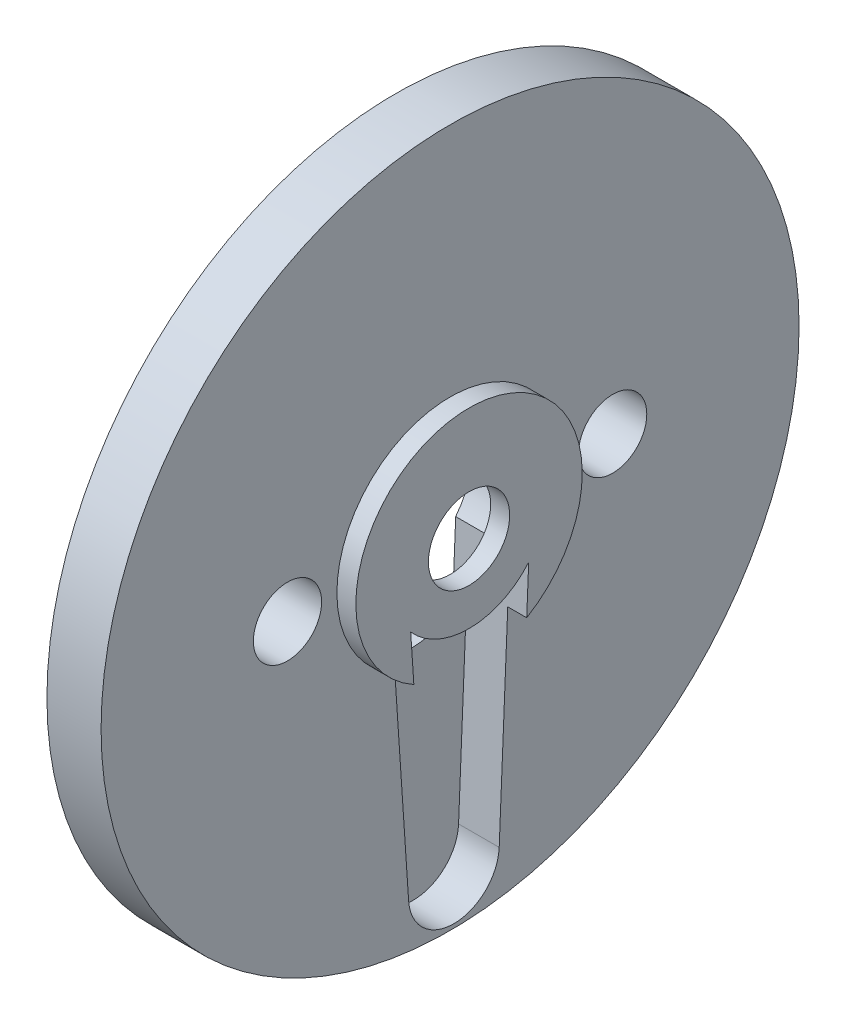
ISO-10303-21;
HEADER;
FILE_DESCRIPTION(('STEP AP214'),'2;1');
FILE_NAME('part.step','',(''),(''),'','','');
FILE_SCHEMA(('AUTOMOTIVE_DESIGN { 1 0 10303 214 1 1 1 1 }'));
ENDSEC;
DATA;
#1=APPLICATION_CONTEXT('core data for automotive mechanical design processes');
#2=APPLICATION_PROTOCOL_DEFINITION('international standard','automotive_design',2000,#1);
#3=PRODUCT_CONTEXT('',#1,'mechanical');
#4=PRODUCT('Part','Part','',(#3));
#5=PRODUCT_RELATED_PRODUCT_CATEGORY('part','',(#4));
#6=PRODUCT_DEFINITION_FORMATION('','',#4);
#7=PRODUCT_DEFINITION_CONTEXT('part definition',#1,'design');
#8=PRODUCT_DEFINITION('design','',#6,#7);
#9=PRODUCT_DEFINITION_SHAPE('','',#8);
#10=(LENGTH_UNIT() NAMED_UNIT(*) SI_UNIT(.MILLI.,.METRE.));
#11=(NAMED_UNIT(*) PLANE_ANGLE_UNIT() SI_UNIT($,.RADIAN.));
#12=(NAMED_UNIT(*) SI_UNIT($,.STERADIAN.) SOLID_ANGLE_UNIT());
#13=UNCERTAINTY_MEASURE_WITH_UNIT(LENGTH_MEASURE(1.E-05),#10,'distance_accuracy_value','');
#14=(GEOMETRIC_REPRESENTATION_CONTEXT(3) GLOBAL_UNCERTAINTY_ASSIGNED_CONTEXT((#13)) GLOBAL_UNIT_ASSIGNED_CONTEXT((#10,
#11,#12)) REPRESENTATION_CONTEXT('',''));
#15=CARTESIAN_POINT('',(0.,0.,0.));
#16=DIRECTION('',(0.,0.,1.));
#17=DIRECTION('',(1.,0.,0.));
#18=AXIS2_PLACEMENT_3D('',#15,#16,#17);
#19=CARTESIAN_POINT('',(-24.638,0.,0.));
#20=DIRECTION('',(-1.,0.,0.));
#21=DIRECTION('',(0.,0.,1.));
#22=AXIS2_PLACEMENT_3D('',#19,#20,#21);
#23=CYLINDRICAL_SURFACE('',#22,3.6576);
#24=CARTESIAN_POINT('',(-25.273,0.,0.));
#25=DIRECTION('',(1.,0.,0.));
#26=DIRECTION('',(0.,0.,-1.));
#27=AXIS2_PLACEMENT_3D('',#24,#25,#26);
#28=CIRCLE('',#27,3.6576);
#29=CARTESIAN_POINT('',(-25.273,-2.42670735163177,2.73662733844715));
#30=VERTEX_POINT('',#29);
#31=CARTESIAN_POINT('',(-25.273,-2.35646642029157,-2.79733869419458));
#32=VERTEX_POINT('',#31);
#33=EDGE_CURVE('E122',#30,#32,#28,.T.);
#34=ORIENTED_EDGE('',*,*,#33,.F.);
#35=DIRECTION('',(-1.,0.,0.));
#36=VECTOR('',#35,1.);
#37=CARTESIAN_POINT('',(-25.908,-2.42670735163177,2.73662733844715));
#38=LINE('',#37,#36);
#39=CARTESIAN_POINT('',(-26.162,-2.42670735163177,2.73662733844715));
#40=VERTEX_POINT('',#39);
#41=EDGE_CURVE('E12',#30,#40,#38,.T.);
#42=ORIENTED_EDGE('',*,*,#41,.T.);
#43=CARTESIAN_POINT('',(-26.162,0.,0.));
#44=DIRECTION('',(1.,0.,0.));
#45=DIRECTION('',(0.,0.,-1.));
#46=AXIS2_PLACEMENT_3D('',#43,#44,#45);
#47=CIRCLE('',#46,3.6576);
#48=CARTESIAN_POINT('',(-26.162,-2.35646642029157,-2.79733869419458));
#49=VERTEX_POINT('',#48);
#50=EDGE_CURVE('E136',#40,#49,#47,.T.);
#51=ORIENTED_EDGE('',*,*,#50,.T.);
#52=DIRECTION('',(-1.,0.,0.));
#53=VECTOR('',#52,1.);
#54=CARTESIAN_POINT('',(-26.162,-2.35646642029157,-2.79733869419458));
#55=LINE('',#54,#53);
#56=EDGE_CURVE('E57',#49,#32,#55,.F.);
#57=ORIENTED_EDGE('',*,*,#56,.T.);
#58=EDGE_LOOP('',(#34,#42,#51,#57));
#59=FACE_BOUND('',#58,.T.);
#60=ADVANCED_FACE('F49',(#59),#23,.T.);
#61=CARTESIAN_POINT('',(-25.273,-2.29265809919101,2.74565981873462));
#62=DIRECTION('',(0.,0.0672293546334898,-0.997737547592334));
#63=DIRECTION('',(0.,0.997737547592334,0.0672293546334898));
#64=AXIS2_PLACEMENT_3D('',#61,#62,#63);
#65=PLANE('',#64);
#66=ORIENTED_EDGE('',*,*,#41,.F.);
#67=DIRECTION('',(0.,0.997737547592334,0.0672293546334893));
#68=VECTOR('',#67,1.);
#69=CARTESIAN_POINT('',(-25.273,-4.63512913951605,2.58781989713528));
#70=LINE('',#69,#68);
#71=CARTESIAN_POINT('',(-25.273,-4.63512913951605,2.58781989713528));
#72=VERTEX_POINT('',#71);
#73=EDGE_CURVE('E125',#72,#30,#70,.T.);
#74=ORIENTED_EDGE('',*,*,#73,.F.);
#75=DIRECTION('',(1.,0.,0.));
#76=VECTOR('',#75,1.);
#77=CARTESIAN_POINT('',(-40.7085695282448,-4.63512913951605,2.58781989713528));
#78=LINE('',#77,#76);
#79=CARTESIAN_POINT('',(-26.162,-4.63512913951605,2.58781989713528));
#80=VERTEX_POINT('',#79);
#81=EDGE_CURVE('E209',#80,#72,#78,.T.);
#82=ORIENTED_EDGE('',*,*,#81,.F.);
#83=DIRECTION('',(0.,-0.997737547592334,-0.0672293546334898));
#84=VECTOR('',#83,1.);
#85=CARTESIAN_POINT('',(-26.162,-0.194533638235004,2.88703522731896));
#86=LINE('',#85,#84);
#87=CARTESIAN_POINT('',(-26.162,-14.1918652152658,1.94386979189401));
#88=VERTEX_POINT('',#87);
#89=EDGE_CURVE('E163',#80,#88,#86,.T.);
#90=ORIENTED_EDGE('',*,*,#89,.T.);
#91=DIRECTION('',(-1.,0.,0.));
#92=VECTOR('',#91,1.);
#93=CARTESIAN_POINT('',(-25.273,-14.1918652152658,1.94386979189401));
#94=LINE('',#93,#92);
#95=CARTESIAN_POINT('',(-28.067,-14.1918652152658,1.94386979189401));
#96=VERTEX_POINT('',#95);
#97=EDGE_CURVE('E178',#88,#96,#94,.T.);
#98=ORIENTED_EDGE('',*,*,#97,.T.);
#99=DIRECTION('',(0.,-0.997737547592334,-0.0672293546334898));
#100=VECTOR('',#99,1.);
#101=CARTESIAN_POINT('',(-28.067,-2.29265809919101,2.74565981873462));
#102=LINE('',#101,#100);
#103=CARTESIAN_POINT('',(-28.067,-5.00603592916988,2.5628275289942));
#104=VERTEX_POINT('',#103);
#105=EDGE_CURVE('E154',#104,#96,#102,.T.);
#106=ORIENTED_EDGE('',*,*,#105,.F.);
#107=DIRECTION('',(1.,0.,0.));
#108=VECTOR('',#107,1.);
#109=CARTESIAN_POINT('',(-30.353,-5.00603592916988,2.5628275289942));
#110=LINE('',#109,#108);
#111=CARTESIAN_POINT('',(-28.702,-5.00603592916988,2.5628275289942));
#112=VERTEX_POINT('',#111);
#113=EDGE_CURVE('E198',#112,#104,#110,.T.);
#114=ORIENTED_EDGE('',*,*,#113,.F.);
#115=DIRECTION('',(0.,0.997737547592334,0.0672293546334898));
#116=VECTOR('',#115,1.);
#117=CARTESIAN_POINT('',(-28.702,-0.194533638235004,2.88703522731896));
#118=LINE('',#117,#116);
#119=CARTESIAN_POINT('',(-28.702,-2.29265809919101,2.74565981873462));
#120=VERTEX_POINT('',#119);
#121=EDGE_CURVE('E147',#112,#120,#118,.T.);
#122=ORIENTED_EDGE('',*,*,#121,.T.);
#123=DIRECTION('',(-1.,0.,0.));
#124=VECTOR('',#123,1.);
#125=CARTESIAN_POINT('',(-25.273,-2.29265809919101,2.74565981873462));
#126=LINE('',#125,#124);
#127=CARTESIAN_POINT('',(-26.162,-2.29265809919101,2.74565981873462));
#128=VERTEX_POINT('',#127);
#129=EDGE_CURVE('E174',#128,#120,#126,.T.);
#130=ORIENTED_EDGE('',*,*,#129,.F.);
#131=EDGE_CURVE('E160',#128,#40,#86,.T.);
#132=ORIENTED_EDGE('',*,*,#131,.T.);
#133=EDGE_LOOP('',(#66,#74,#82,#90,#98,#106,#114,#122,#130,#132));
#134=FACE_BOUND('',#133,.T.);
#135=ADVANCED_FACE('F221',(#134),#65,.T.);
#136=CARTESIAN_POINT('',(-25.273,-14.1379552704451,-2.30345150307179));
#137=DIRECTION('',(0.,0.0418838234530849,0.999122487652516));
#138=DIRECTION('',(0.,-0.999122487652516,0.0418838234530849));
#139=AXIS2_PLACEMENT_3D('',#136,#137,#138);
#140=PLANE('',#139);
#141=DIRECTION('',(1.,0.,0.));
#142=VECTOR('',#141,1.);
#143=CARTESIAN_POINT('',(-40.7085695282448,-4.5679536754535,-2.70463180098714));
#144=LINE('',#143,#142);
#145=CARTESIAN_POINT('',(-26.162,-4.5679536754535,-2.70463180098715));
#146=VERTEX_POINT('',#145);
#147=CARTESIAN_POINT('',(-25.273,-4.5679536754535,-2.70463180098714));
#148=VERTEX_POINT('',#147);
#149=EDGE_CURVE('E132',#146,#148,#144,.T.);
#150=ORIENTED_EDGE('',*,*,#149,.T.);
#151=DIRECTION('',(0.,-0.999122487652515,0.0418838234530849));
#152=VECTOR('',#151,1.);
#153=CARTESIAN_POINT('',(-25.273,-2.35646642029157,-2.79733869419458));
#154=LINE('',#153,#152);
#155=EDGE_CURVE('E64',#32,#148,#154,.T.);
#156=ORIENTED_EDGE('',*,*,#155,.F.);
#157=ORIENTED_EDGE('',*,*,#56,.F.);
#158=DIRECTION('',(0.,0.999122487652516,-0.0418838234530849));
#159=VECTOR('',#158,1.);
#160=CARTESIAN_POINT('',(-26.162,-0.121194270031896,-2.89104266469678));
#161=LINE('',#160,#159);
#162=CARTESIAN_POINT('',(-26.162,-2.22223109669393,-2.8029659207501));
#163=VERTEX_POINT('',#162);
#164=EDGE_CURVE('E169',#49,#163,#161,.T.);
#165=ORIENTED_EDGE('',*,*,#164,.T.);
#166=DIRECTION('',(-1.,0.,0.));
#167=VECTOR('',#166,1.);
#168=CARTESIAN_POINT('',(-25.273,-2.22223109669393,-2.8029659207501));
#169=LINE('',#168,#167);
#170=CARTESIAN_POINT('',(-28.702,-2.22223109669393,-2.8029659207501));
#171=VERTEX_POINT('',#170);
#172=EDGE_CURVE('E183',#163,#171,#169,.T.);
#173=ORIENTED_EDGE('',*,*,#172,.T.);
#174=DIRECTION('',(0.,-0.999122487652516,0.0418838234530849));
#175=VECTOR('',#174,1.);
#176=CARTESIAN_POINT('',(-28.702,-0.121194270031896,-2.89104266469678));
#177=LINE('',#176,#175);
#178=CARTESIAN_POINT('',(-28.702,-4.9009813445306,-2.69067107818389));
#179=VERTEX_POINT('',#178);
#180=EDGE_CURVE('E140',#171,#179,#177,.T.);
#181=ORIENTED_EDGE('',*,*,#180,.T.);
#182=DIRECTION('',(1.,0.,0.));
#183=VECTOR('',#182,1.);
#184=CARTESIAN_POINT('',(-30.353,-4.9009813445306,-2.69067107818389));
#185=LINE('',#184,#183);
#186=CARTESIAN_POINT('',(-28.067,-4.9009813445306,-2.69067107818389));
#187=VERTEX_POINT('',#186);
#188=EDGE_CURVE('E195',#179,#187,#185,.T.);
#189=ORIENTED_EDGE('',*,*,#188,.T.);
#190=DIRECTION('',(0.,0.999122487652516,-0.0418838234530849));
#191=VECTOR('',#190,1.);
#192=CARTESIAN_POINT('',(-28.067,-14.1379552704451,-2.30345150307179));
#193=LINE('',#192,#191);
#194=CARTESIAN_POINT('',(-28.067,-14.1379552704451,-2.30345150307179));
#195=VERTEX_POINT('',#194);
#196=EDGE_CURVE('E185',#195,#187,#193,.T.);
#197=ORIENTED_EDGE('',*,*,#196,.F.);
#198=DIRECTION('',(-1.,0.,0.));
#199=VECTOR('',#198,1.);
#200=CARTESIAN_POINT('',(-25.273,-14.1379552704451,-2.30345150307179));
#201=LINE('',#200,#199);
#202=CARTESIAN_POINT('',(-26.162,-14.1379552704451,-2.30345150307179));
#203=VERTEX_POINT('',#202);
#204=EDGE_CURVE('E181',#203,#195,#201,.T.);
#205=ORIENTED_EDGE('',*,*,#204,.F.);
#206=EDGE_CURVE('E167',#203,#146,#161,.T.);
#207=ORIENTED_EDGE('',*,*,#206,.T.);
#208=EDGE_LOOP('',(#150,#156,#157,#165,#173,#181,#189,#197,#205,#207));
#209=FACE_BOUND('',#208,.T.);
#210=ADVANCED_FACE('F130',(#209),#140,.T.);
#211=CARTESIAN_POINT('',(-24.638,0.,0.));
#212=DIRECTION('',(-1.,0.,0.));
#213=DIRECTION('',(0.,0.,1.));
#214=AXIS2_PLACEMENT_3D('',#211,#212,#213);
#215=CYLINDRICAL_SURFACE('',#214,1.905);
#216=CARTESIAN_POINT('',(-26.162,0.,0.));
#217=DIRECTION('',(1.,0.,0.));
#218=DIRECTION('',(0.,0.,-1.));
#219=AXIS2_PLACEMENT_3D('',#216,#217,#218);
#220=CIRCLE('',#219,1.905);
#221=CARTESIAN_POINT('',(-26.162,0.,1.905));
#222=VERTEX_POINT('',#221);
#223=EDGE_CURVE('E205',#222,#222,#220,.T.);
#224=CARTESIAN_POINT('',(-25.273,0.,0.));
#225=DIRECTION('',(1.,0.,0.));
#226=DIRECTION('',(0.,0.,-1.));
#227=AXIS2_PLACEMENT_3D('',#224,#225,#226);
#228=CIRCLE('',#227,1.905);
#229=CARTESIAN_POINT('',(-25.273,0.,1.905));
#230=VERTEX_POINT('',#229);
#231=EDGE_CURVE('E215',#230,#230,#228,.T.);
#232=CARTESIAN_POINT('',(-26.162,0.,1.905));
#233=CARTESIAN_POINT('',(-26.1527395833333,0.,1.905));
#234=CARTESIAN_POINT('',(-26.1434791666667,0.,1.905));
#235=CARTESIAN_POINT('',(-26.1249583333333,0.,1.905));
#236=CARTESIAN_POINT('',(-26.1156979166667,0.,1.905));
#237=CARTESIAN_POINT('',(-26.0971770833333,0.,1.905));
#238=CARTESIAN_POINT('',(-26.0879166666667,0.,1.905));
#239=CARTESIAN_POINT('',(-26.0693958333333,0.,1.905));
#240=CARTESIAN_POINT('',(-26.0601354166667,0.,1.905));
#241=CARTESIAN_POINT('',(-26.0416145833333,0.,1.905));
#242=CARTESIAN_POINT('',(-26.0323541666667,0.,1.905));
#243=CARTESIAN_POINT('',(-26.0138333333333,0.,1.905));
#244=CARTESIAN_POINT('',(-26.0045729166667,0.,1.905));
#245=CARTESIAN_POINT('',(-25.9860520833333,0.,1.905));
#246=CARTESIAN_POINT('',(-25.9767916666667,0.,1.905));
#247=CARTESIAN_POINT('',(-25.9582708333333,0.,1.905));
#248=CARTESIAN_POINT('',(-25.9490104166667,0.,1.905));
#249=CARTESIAN_POINT('',(-25.9304895833333,0.,1.905));
#250=CARTESIAN_POINT('',(-25.9212291666667,0.,1.905));
#251=CARTESIAN_POINT('',(-25.9027083333333,0.,1.905));
#252=CARTESIAN_POINT('',(-25.8934479166667,0.,1.905));
#253=CARTESIAN_POINT('',(-25.8749270833333,0.,1.905));
#254=CARTESIAN_POINT('',(-25.8656666666667,0.,1.905));
#255=CARTESIAN_POINT('',(-25.8471458333333,0.,1.905));
#256=CARTESIAN_POINT('',(-25.8378854166667,0.,1.905));
#257=CARTESIAN_POINT('',(-25.8193645833333,0.,1.905));
#258=CARTESIAN_POINT('',(-25.8101041666667,0.,1.905));
#259=CARTESIAN_POINT('',(-25.7915833333333,0.,1.905));
#260=CARTESIAN_POINT('',(-25.7823229166667,0.,1.905));
#261=CARTESIAN_POINT('',(-25.7638020833333,0.,1.905));
#262=CARTESIAN_POINT('',(-25.7545416666667,0.,1.905));
#263=CARTESIAN_POINT('',(-25.7360208333333,0.,1.905));
#264=CARTESIAN_POINT('',(-25.7267604166667,0.,1.905));
#265=CARTESIAN_POINT('',(-25.7082395833333,0.,1.905));
#266=CARTESIAN_POINT('',(-25.6989791666667,0.,1.905));
#267=CARTESIAN_POINT('',(-25.6804583333333,0.,1.905));
#268=CARTESIAN_POINT('',(-25.6711979166667,0.,1.905));
#269=CARTESIAN_POINT('',(-25.6526770833333,0.,1.905));
#270=CARTESIAN_POINT('',(-25.6434166666667,0.,1.905));
#271=CARTESIAN_POINT('',(-25.6248958333333,0.,1.905));
#272=CARTESIAN_POINT('',(-25.6156354166667,0.,1.905));
#273=CARTESIAN_POINT('',(-25.5971145833333,0.,1.905));
#274=CARTESIAN_POINT('',(-25.5878541666667,0.,1.905));
#275=CARTESIAN_POINT('',(-25.5693333333333,0.,1.905));
#276=CARTESIAN_POINT('',(-25.5600729166667,0.,1.905));
#277=CARTESIAN_POINT('',(-25.5415520833333,0.,1.905));
#278=CARTESIAN_POINT('',(-25.5322916666667,0.,1.905));
#279=CARTESIAN_POINT('',(-25.5137708333333,0.,1.905));
#280=CARTESIAN_POINT('',(-25.5045104166667,0.,1.905));
#281=CARTESIAN_POINT('',(-25.4859895833333,0.,1.905));
#282=CARTESIAN_POINT('',(-25.4767291666667,0.,1.905));
#283=CARTESIAN_POINT('',(-25.4582083333333,0.,1.905));
#284=CARTESIAN_POINT('',(-25.4489479166667,0.,1.905));
#285=CARTESIAN_POINT('',(-25.4304270833333,0.,1.905));
#286=CARTESIAN_POINT('',(-25.4211666666667,0.,1.905));
#287=CARTESIAN_POINT('',(-25.4026458333333,0.,1.905));
#288=CARTESIAN_POINT('',(-25.3933854166667,0.,1.905));
#289=CARTESIAN_POINT('',(-25.3748645833333,0.,1.905));
#290=CARTESIAN_POINT('',(-25.3656041666667,0.,1.905));
#291=CARTESIAN_POINT('',(-25.3470833333333,0.,1.905));
#292=CARTESIAN_POINT('',(-25.3378229166667,0.,1.905));
#293=CARTESIAN_POINT('',(-25.3193020833333,0.,1.905));
#294=CARTESIAN_POINT('',(-25.3100416666667,0.,1.905));
#295=CARTESIAN_POINT('',(-25.2915208333333,0.,1.905));
#296=CARTESIAN_POINT('',(-25.2822604166667,0.,1.905));
#297=CARTESIAN_POINT('',(-25.273,0.,1.905));
#298=B_SPLINE_CURVE_WITH_KNOTS('',3,(#232,#233,#234,#235,#236,#237,#238,#239,#240,#241,#242,
#243,#244,#245,#246,#247,#248,#249,#250,#251,#252,#253,#254,#255,#256,#257,#258,#259,#260,#261,
#262,#263,#264,#265,#266,#267,#268,#269,#270,#271,#272,#273,#274,#275,#276,#277,#278,#279,#280,
#281,#282,#283,#284,#285,#286,#287,#288,#289,#290,#291,#292,#293,#294,#295,#296,#297),
.UNSPECIFIED.,.F.,.F.,(4,2,2,2,2,2,2,2,2,2,2,2,2,2,2,2,2,2,2,2,2,2,2,2,2,2,2,2,2,2,2,2,4),(0.,
0.0277812500000009,0.0555625000000018,0.0833437500000027,0.111125,0.138906250000001,
0.166687500000002,0.194468750000003,0.22225,0.250031250000001,0.277812500000002,
0.305593750000003,0.333375,0.361156250000001,0.388937500000002,0.416718750000003,0.4445,
0.472281250000001,0.500062500000002,0.527843750000003,0.555625000000001,0.583406250000001,
0.611187500000002,0.638968750000003,0.666750000000001,0.694531250000002,0.722312500000002,
0.750093750000003,0.777875000000001,0.805656250000002,0.833437500000003,0.861218750000003,
0.889000000000001),.UNSPECIFIED.);
#299=EDGE_CURVE('BSEAM262',#222,#230,#298,.T.);
#300=ORIENTED_EDGE('',*,*,#223,.F.);
#301=ORIENTED_EDGE('',*,*,#231,.T.);
#302=ORIENTED_EDGE('',*,*,#299,.T.);
#303=ORIENTED_EDGE('',*,*,#299,.F.);
#304=EDGE_LOOP('',(#300,#302,#301,#303));
#305=FACE_BOUND('',#304,.T.);
#306=ADVANCED_FACE('F262',(#305),#215,.F.);
#307=CARTESIAN_POINT('',(-40.7085695282448,0.,0.));
#308=DIRECTION('',(1.,0.,0.));
#309=DIRECTION('',(0.,0.,-1.));
#310=AXIS2_PLACEMENT_3D('',#307,#308,#309);
#311=CYLINDRICAL_SURFACE('',#310,5.3086);
#312=ORIENTED_EDGE('',*,*,#81,.T.);
#313=CARTESIAN_POINT('',(-25.273,0.,0.));
#314=DIRECTION('',(1.,0.,0.));
#315=DIRECTION('',(0.,0.,-1.));
#316=AXIS2_PLACEMENT_3D('',#313,#314,#315);
#317=CIRCLE('',#316,5.3086);
#318=EDGE_CURVE('E133',#148,#72,#317,.T.);
#319=ORIENTED_EDGE('',*,*,#318,.F.);
#320=ORIENTED_EDGE('',*,*,#149,.F.);
#321=CARTESIAN_POINT('',(-26.162,0.,0.));
#322=DIRECTION('',(-1.,0.,0.));
#323=DIRECTION('',(0.,0.,1.));
#324=AXIS2_PLACEMENT_3D('',#321,#322,#323);
#325=CIRCLE('',#324,5.3086);
#326=EDGE_CURVE('E212',#146,#80,#325,.F.);
#327=ORIENTED_EDGE('',*,*,#326,.T.);
#328=EDGE_LOOP('',(#312,#319,#320,#327));
#329=FACE_BOUND('',#328,.T.);
#330=ADVANCED_FACE('F222',(#329),#311,.T.);
#331=CARTESIAN_POINT('',(-26.162,0.,0.));
#332=DIRECTION('',(-1.,0.,0.));
#333=DIRECTION('',(0.,0.,1.));
#334=AXIS2_PLACEMENT_3D('',#331,#332,#333);
#335=PLANE('',#334);
#336=ORIENTED_EDGE('',*,*,#89,.F.);
#337=ORIENTED_EDGE('',*,*,#326,.F.);
#338=ORIENTED_EDGE('',*,*,#206,.F.);
#339=CARTESIAN_POINT('',(-26.162,-14.0488683779604,-0.178317971834886));
#340=DIRECTION('',(-1.,0.,0.));
#341=DIRECTION('',(0.,0.,1.));
#342=AXIS2_PLACEMENT_3D('',#339,#340,#341);
#343=CIRCLE('',#342,2.127);
#344=EDGE_CURVE('E164',#88,#203,#343,.F.);
#345=ORIENTED_EDGE('',*,*,#344,.F.);
#346=EDGE_LOOP('',(#336,#337,#338,#345));
#347=FACE_BOUND('',#346,.T.);
#348=CARTESIAN_POINT('',(-26.162,0.,7.624820031));
#349=DIRECTION('',(1.,0.,0.));
#350=DIRECTION('',(0.,0.,-1.));
#351=AXIS2_PLACEMENT_3D('',#348,#349,#350);
#352=CIRCLE('',#351,1.6002);
#353=CARTESIAN_POINT('',(-26.162,0.,6.024620031));
#354=VERTEX_POINT('',#353);
#355=EDGE_CURVE('E158',#354,#354,#352,.T.);
#356=ORIENTED_EDGE('',*,*,#355,.F.);
#357=EDGE_LOOP('',(#356));
#358=FACE_BOUND('',#357,.T.);
#359=CARTESIAN_POINT('',(-26.162,0.,-7.62482003100001));
#360=DIRECTION('',(1.,0.,0.));
#361=DIRECTION('',(0.,0.,-1.));
#362=AXIS2_PLACEMENT_3D('',#359,#360,#361);
#363=CIRCLE('',#362,1.6002);
#364=CARTESIAN_POINT('',(-26.162,0.,-9.22502003100001));
#365=VERTEX_POINT('',#364);
#366=EDGE_CURVE('E192',#365,#365,#363,.T.);
#367=ORIENTED_EDGE('',*,*,#366,.F.);
#368=EDGE_LOOP('',(#367));
#369=FACE_BOUND('',#368,.T.);
#370=CARTESIAN_POINT('',(-26.162,0.,0.));
#371=DIRECTION('',(-1.,0.,0.));
#372=DIRECTION('',(0.,0.,1.));
#373=AXIS2_PLACEMENT_3D('',#370,#371,#372);
#374=CIRCLE('',#373,16.367500031);
#375=CARTESIAN_POINT('',(-26.162,0.,16.367500031));
#376=VERTEX_POINT('',#375);
#377=EDGE_CURVE('E170',#376,#376,#374,.T.);
#378=ORIENTED_EDGE('',*,*,#377,.F.);
#379=EDGE_LOOP('',(#378));
#380=FACE_BOUND('',#379,.T.);
#381=ADVANCED_FACE('F228',(#347,#358,#369,#380),#335,.F.);
#382=CARTESIAN_POINT('',(-28.702,0.,0.));
#383=DIRECTION('',(-1.,0.,0.));
#384=DIRECTION('',(0.,0.,1.));
#385=AXIS2_PLACEMENT_3D('',#382,#383,#384);
#386=PLANE('',#385);
#387=CARTESIAN_POINT('',(-28.702,0.,0.));
#388=DIRECTION('',(-1.,0.,0.));
#389=DIRECTION('',(0.,0.,1.));
#390=AXIS2_PLACEMENT_3D('',#387,#388,#389);
#391=CIRCLE('',#390,3.57699999999999);
#392=EDGE_CURVE('E138',#120,#171,#391,.T.);
#393=ORIENTED_EDGE('',*,*,#392,.F.);
#394=ORIENTED_EDGE('',*,*,#121,.F.);
#395=CARTESIAN_POINT('',(-28.702,-1.75695177114637,0.));
#396=DIRECTION('',(-1.,0.,0.));
#397=DIRECTION('',(0.,0.,1.));
#398=AXIS2_PLACEMENT_3D('',#395,#396,#397);
#399=CIRCLE('',#398,4.13819197346979);
#400=EDGE_CURVE('E144',#179,#112,#399,.T.);
#401=ORIENTED_EDGE('',*,*,#400,.F.);
#402=ORIENTED_EDGE('',*,*,#180,.F.);
#403=EDGE_LOOP('',(#393,#394,#401,#402));
#404=FACE_BOUND('',#403,.T.);
#405=CARTESIAN_POINT('',(-28.702,0.,7.624820031));
#406=DIRECTION('',(-1.,0.,0.));
#407=DIRECTION('',(0.,0.,1.));
#408=AXIS2_PLACEMENT_3D('',#405,#406,#407);
#409=CIRCLE('',#408,1.6002);
#410=CARTESIAN_POINT('',(-28.702,0.,9.225020031));
#411=VERTEX_POINT('',#410);
#412=EDGE_CURVE('E151',#411,#411,#409,.T.);
#413=ORIENTED_EDGE('',*,*,#412,.F.);
#414=EDGE_LOOP('',(#413));
#415=FACE_BOUND('',#414,.T.);
#416=CARTESIAN_POINT('',(-28.702,0.,-7.62482003100001));
#417=DIRECTION('',(-1.,0.,0.));
#418=DIRECTION('',(0.,0.,1.));
#419=AXIS2_PLACEMENT_3D('',#416,#417,#418);
#420=CIRCLE('',#419,1.6002);
#421=CARTESIAN_POINT('',(-28.702,0.,-6.024620031));
#422=VERTEX_POINT('',#421);
#423=EDGE_CURVE('E155',#422,#422,#420,.T.);
#424=ORIENTED_EDGE('',*,*,#423,.F.);
#425=EDGE_LOOP('',(#424));
#426=FACE_BOUND('',#425,.T.);
#427=CARTESIAN_POINT('',(-28.702,0.,0.));
#428=DIRECTION('',(-1.,0.,0.));
#429=DIRECTION('',(0.,0.,1.));
#430=AXIS2_PLACEMENT_3D('',#427,#428,#429);
#431=CIRCLE('',#430,16.367500031);
#432=CARTESIAN_POINT('',(-28.702,0.,16.367500031));
#433=VERTEX_POINT('',#432);
#434=EDGE_CURVE('E173',#433,#433,#431,.T.);
#435=ORIENTED_EDGE('',*,*,#434,.T.);
#436=EDGE_LOOP('',(#435));
#437=FACE_BOUND('',#436,.T.);
#438=ADVANCED_FACE('F248',(#404,#415,#426,#437),#386,.T.);
#439=CARTESIAN_POINT('',(-28.702,0.,0.));
#440=DIRECTION('',(1.,0.,0.));
#441=DIRECTION('',(0.,0.,-1.));
#442=AXIS2_PLACEMENT_3D('',#439,#440,#441);
#443=CYLINDRICAL_SURFACE('',#442,16.367500031);
#444=ORIENTED_EDGE('',*,*,#434,.F.);
#445=EDGE_LOOP('',(#444));
#446=FACE_BOUND('',#445,.T.);
#447=ORIENTED_EDGE('',*,*,#377,.T.);
#448=EDGE_LOOP('',(#447));
#449=FACE_BOUND('',#448,.T.);
#450=ADVANCED_FACE('F51',(#446,#449),#443,.T.);
#451=CARTESIAN_POINT('',(-25.273,0.,0.));
#452=DIRECTION('',(-1.,0.,0.));
#453=DIRECTION('',(0.,0.,1.));
#454=AXIS2_PLACEMENT_3D('',#451,#452,#453);
#455=CYLINDRICAL_SURFACE('',#454,3.57699999999999);
#456=CARTESIAN_POINT('',(-26.162,0.,0.));
#457=DIRECTION('',(-1.,0.,0.));
#458=DIRECTION('',(0.,0.,1.));
#459=AXIS2_PLACEMENT_3D('',#456,#457,#458);
#460=CIRCLE('',#459,3.57699999999999);
#461=EDGE_CURVE('E150',#163,#128,#460,.F.);
#462=ORIENTED_EDGE('',*,*,#461,.T.);
#463=ORIENTED_EDGE('',*,*,#129,.T.);
#464=ORIENTED_EDGE('',*,*,#392,.T.);
#465=ORIENTED_EDGE('',*,*,#172,.F.);
#466=EDGE_LOOP('',(#462,#463,#464,#465));
#467=FACE_BOUND('',#466,.T.);
#468=ADVANCED_FACE('F252',(#467),#455,.F.);
#469=CARTESIAN_POINT('',(-25.273,-14.0488683779604,-0.178317971834886));
#470=DIRECTION('',(-1.,0.,0.));
#471=DIRECTION('',(0.,0.,1.));
#472=AXIS2_PLACEMENT_3D('',#469,#470,#471);
#473=CYLINDRICAL_SURFACE('',#472,2.127);
#474=ORIENTED_EDGE('',*,*,#344,.T.);
#475=ORIENTED_EDGE('',*,*,#204,.T.);
#476=CARTESIAN_POINT('',(-28.067,-14.0488683779604,-0.178317971834886));
#477=DIRECTION('',(1.,0.,0.));
#478=DIRECTION('',(0.,0.,-1.));
#479=AXIS2_PLACEMENT_3D('',#476,#477,#478);
#480=CIRCLE('',#479,2.127);
#481=EDGE_CURVE('E188',#96,#195,#480,.T.);
#482=ORIENTED_EDGE('',*,*,#481,.F.);
#483=ORIENTED_EDGE('',*,*,#97,.F.);
#484=EDGE_LOOP('',(#474,#475,#482,#483));
#485=FACE_BOUND('',#484,.T.);
#486=ADVANCED_FACE('F234',(#485),#473,.F.);
#487=CARTESIAN_POINT('',(-28.067,0.,0.));
#488=DIRECTION('',(-1.,0.,0.));
#489=DIRECTION('',(0.,0.,1.));
#490=AXIS2_PLACEMENT_3D('',#487,#488,#489);
#491=PLANE('',#490);
#492=CARTESIAN_POINT('',(-28.067,-1.75695177114637,0.));
#493=DIRECTION('',(1.,0.,0.));
#494=DIRECTION('',(0.,0.,-1.));
#495=AXIS2_PLACEMENT_3D('',#492,#493,#494);
#496=CIRCLE('',#495,4.13819197346979);
#497=EDGE_CURVE('E200',#104,#187,#496,.T.);
#498=ORIENTED_EDGE('',*,*,#497,.F.);
#499=ORIENTED_EDGE('',*,*,#105,.T.);
#500=ORIENTED_EDGE('',*,*,#481,.T.);
#501=ORIENTED_EDGE('',*,*,#196,.T.);
#502=EDGE_LOOP('',(#498,#499,#500,#501));
#503=FACE_BOUND('',#502,.T.);
#504=ADVANCED_FACE('F238',(#503),#491,.F.);
#505=CARTESIAN_POINT('',(-40.386,0.,-7.62482003100001));
#506=DIRECTION('',(1.,0.,0.));
#507=DIRECTION('',(0.,0.,-1.));
#508=AXIS2_PLACEMENT_3D('',#505,#506,#507);
#509=CYLINDRICAL_SURFACE('',#508,1.6002);
#510=ORIENTED_EDGE('',*,*,#423,.T.);
#511=EDGE_LOOP('',(#510));
#512=FACE_BOUND('',#511,.T.);
#513=ORIENTED_EDGE('',*,*,#366,.T.);
#514=EDGE_LOOP('',(#513));
#515=FACE_BOUND('',#514,.T.);
#516=ADVANCED_FACE('F287',(#512,#515),#509,.F.);
#517=CARTESIAN_POINT('',(-40.386,0.,7.624820031));
#518=DIRECTION('',(1.,0.,0.));
#519=DIRECTION('',(0.,0.,-1.));
#520=AXIS2_PLACEMENT_3D('',#517,#518,#519);
#521=CYLINDRICAL_SURFACE('',#520,1.6002);
#522=ORIENTED_EDGE('',*,*,#412,.T.);
#523=EDGE_LOOP('',(#522));
#524=FACE_BOUND('',#523,.T.);
#525=ORIENTED_EDGE('',*,*,#355,.T.);
#526=EDGE_LOOP('',(#525));
#527=FACE_BOUND('',#526,.T.);
#528=ADVANCED_FACE('F284',(#524,#527),#521,.F.);
#529=CARTESIAN_POINT('',(-30.353,-1.75695177114637,0.));
#530=DIRECTION('',(1.,0.,0.));
#531=DIRECTION('',(0.,0.,-1.));
#532=AXIS2_PLACEMENT_3D('',#529,#530,#531);
#533=CYLINDRICAL_SURFACE('',#532,4.13819197346979);
#534=ORIENTED_EDGE('',*,*,#400,.T.);
#535=ORIENTED_EDGE('',*,*,#113,.T.);
#536=ORIENTED_EDGE('',*,*,#497,.T.);
#537=ORIENTED_EDGE('',*,*,#188,.F.);
#538=EDGE_LOOP('',(#534,#535,#536,#537));
#539=FACE_BOUND('',#538,.T.);
#540=ADVANCED_FACE('F243',(#539),#533,.F.);
#541=CARTESIAN_POINT('',(-26.162,0.,0.));
#542=DIRECTION('',(1.,0.,0.));
#543=DIRECTION('',(0.,0.,-1.));
#544=AXIS2_PLACEMENT_3D('',#541,#542,#543);
#545=PLANE('',#544);
#546=ORIENTED_EDGE('',*,*,#164,.F.);
#547=ORIENTED_EDGE('',*,*,#50,.F.);
#548=ORIENTED_EDGE('',*,*,#131,.F.);
#549=ORIENTED_EDGE('',*,*,#461,.F.);
#550=EDGE_LOOP('',(#546,#547,#548,#549));
#551=FACE_BOUND('',#550,.T.);
#552=ORIENTED_EDGE('',*,*,#223,.T.);
#553=EDGE_LOOP('',(#552));
#554=FACE_BOUND('',#553,.T.);
#555=ADVANCED_FACE('F256',(#551,#554),#545,.F.);
#556=CARTESIAN_POINT('',(-25.273,0.,0.));
#557=DIRECTION('',(1.,0.,0.));
#558=DIRECTION('',(0.,0.,-1.));
#559=AXIS2_PLACEMENT_3D('',#556,#557,#558);
#560=PLANE('',#559);
#561=ORIENTED_EDGE('',*,*,#231,.F.);
#562=EDGE_LOOP('',(#561));
#563=FACE_BOUND('',#562,.T.);
#564=ORIENTED_EDGE('',*,*,#33,.T.);
#565=ORIENTED_EDGE('',*,*,#155,.T.);
#566=ORIENTED_EDGE('',*,*,#318,.T.);
#567=ORIENTED_EDGE('',*,*,#73,.T.);
#568=EDGE_LOOP('',(#564,#565,#566,#567));
#569=FACE_BOUND('',#568,.T.);
#570=ADVANCED_FACE('F123',(#563,#569),#560,.T.);
#571=CLOSED_SHELL('',(#60,#135,#210,#306,#330,#381,#438,#450,#468,#486,#504,#516,#528,#540,#555,#570));
#572=MANIFOLD_SOLID_BREP('B2',#571);
#573=ADVANCED_BREP_SHAPE_REPRESENTATION('',(#18,#572),#14);
#574=SHAPE_DEFINITION_REPRESENTATION(#9,#573);
ENDSEC;
END-ISO-10303-21;
